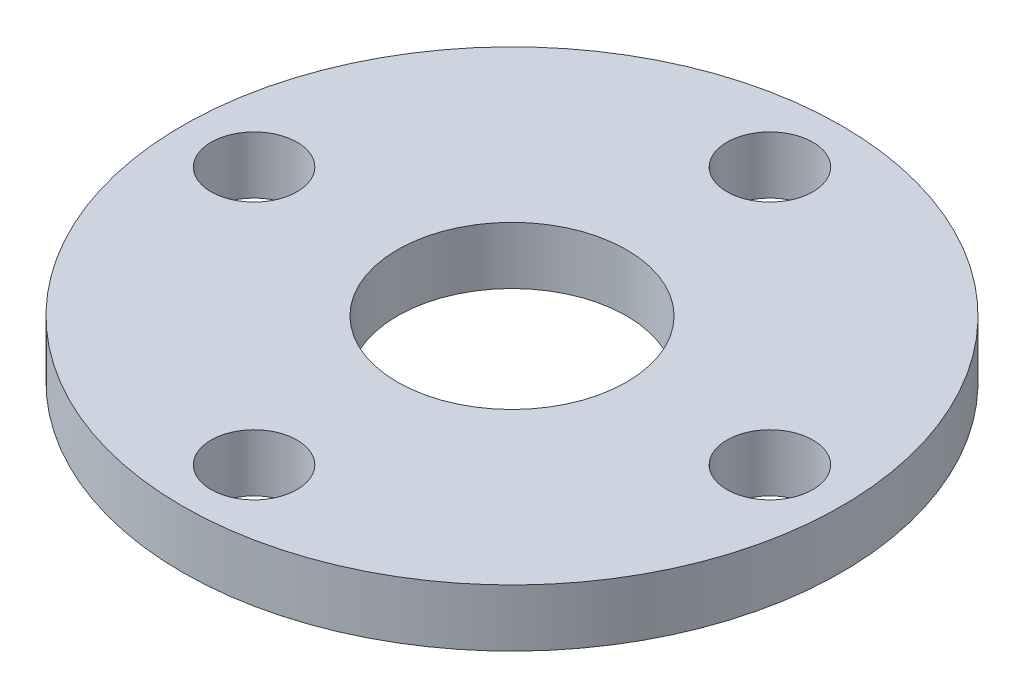
ISO-10303-21;
HEADER;
FILE_DESCRIPTION(('STEP AP214'),'2;1');
FILE_NAME('part.step','',(''),(''),'','','');
FILE_SCHEMA(('AUTOMOTIVE_DESIGN { 1 0 10303 214 1 1 1 1 }'));
ENDSEC;
DATA;
#1=APPLICATION_CONTEXT('core data for automotive mechanical design processes');
#2=APPLICATION_PROTOCOL_DEFINITION('international standard','automotive_design',2000,#1);
#3=PRODUCT_CONTEXT('',#1,'mechanical');
#4=PRODUCT('Part','Part','',(#3));
#5=PRODUCT_RELATED_PRODUCT_CATEGORY('part','',(#4));
#6=PRODUCT_DEFINITION_FORMATION('','',#4);
#7=PRODUCT_DEFINITION_CONTEXT('part definition',#1,'design');
#8=PRODUCT_DEFINITION('design','',#6,#7);
#9=PRODUCT_DEFINITION_SHAPE('','',#8);
#10=(LENGTH_UNIT() NAMED_UNIT(*) SI_UNIT(.MILLI.,.METRE.));
#11=(NAMED_UNIT(*) PLANE_ANGLE_UNIT() SI_UNIT($,.RADIAN.));
#12=(NAMED_UNIT(*) SI_UNIT($,.STERADIAN.) SOLID_ANGLE_UNIT());
#13=UNCERTAINTY_MEASURE_WITH_UNIT(LENGTH_MEASURE(1.E-05),#10,'distance_accuracy_value','');
#14=(GEOMETRIC_REPRESENTATION_CONTEXT(3) GLOBAL_UNCERTAINTY_ASSIGNED_CONTEXT((#13)) GLOBAL_UNIT_ASSIGNED_CONTEXT((#10,
#11,#12)) REPRESENTATION_CONTEXT('',''));
#15=CARTESIAN_POINT('',(0.,0.,0.));
#16=DIRECTION('',(0.,0.,1.));
#17=DIRECTION('',(1.,0.,0.));
#18=AXIS2_PLACEMENT_3D('',#15,#16,#17);
#19=CARTESIAN_POINT('',(0.,2.,0.));
#20=DIRECTION('',(0.,1.,0.));
#21=DIRECTION('',(0.,0.,1.));
#22=AXIS2_PLACEMENT_3D('',#19,#20,#21);
#23=PLANE('',#22);
#24=CARTESIAN_POINT('',(-9.,2.,0.));
#25=DIRECTION('',(0.,1.,0.));
#26=DIRECTION('',(0.,0.,1.));
#27=AXIS2_PLACEMENT_3D('',#24,#25,#26);
#28=CIRCLE('',#27,1.5);
#29=CARTESIAN_POINT('',(-9.,2.,1.5));
#30=VERTEX_POINT('',#29);
#31=EDGE_CURVE('E59',#30,#30,#28,.T.);
#32=ORIENTED_EDGE('',*,*,#31,.F.);
#33=EDGE_LOOP('',(#32));
#34=FACE_BOUND('',#33,.T.);
#35=CARTESIAN_POINT('',(9.,2.,0.));
#36=DIRECTION('',(0.,1.,0.));
#37=DIRECTION('',(0.,0.,1.));
#38=AXIS2_PLACEMENT_3D('',#35,#36,#37);
#39=CIRCLE('',#38,1.5);
#40=CARTESIAN_POINT('',(9.,2.,1.5));
#41=VERTEX_POINT('',#40);
#42=EDGE_CURVE('E47',#41,#41,#39,.T.);
#43=ORIENTED_EDGE('',*,*,#42,.F.);
#44=EDGE_LOOP('',(#43));
#45=FACE_BOUND('',#44,.T.);
#46=CARTESIAN_POINT('',(0.,2.,0.));
#47=DIRECTION('',(0.,1.,0.));
#48=DIRECTION('',(0.,0.,1.));
#49=AXIS2_PLACEMENT_3D('',#46,#47,#48);
#50=CIRCLE('',#49,11.5);
#51=CARTESIAN_POINT('',(0.,2.,11.5));
#52=VERTEX_POINT('',#51);
#53=EDGE_CURVE('E10',#52,#52,#50,.T.);
#54=ORIENTED_EDGE('',*,*,#53,.T.);
#55=EDGE_LOOP('',(#54));
#56=FACE_BOUND('',#55,.T.);
#57=CARTESIAN_POINT('',(0.,2.,0.));
#58=DIRECTION('',(0.,1.,0.));
#59=DIRECTION('',(0.,0.,1.));
#60=AXIS2_PLACEMENT_3D('',#57,#58,#59);
#61=CIRCLE('',#60,4.);
#62=CARTESIAN_POINT('',(0.,2.,4.));
#63=VERTEX_POINT('',#62);
#64=EDGE_CURVE('E42',#63,#63,#61,.T.);
#65=ORIENTED_EDGE('',*,*,#64,.F.);
#66=EDGE_LOOP('',(#65));
#67=FACE_BOUND('',#66,.T.);
#68=CARTESIAN_POINT('',(0.,2.,-9.));
#69=DIRECTION('',(0.,1.,0.));
#70=DIRECTION('',(0.,0.,1.));
#71=AXIS2_PLACEMENT_3D('',#68,#69,#70);
#72=CIRCLE('',#71,1.5);
#73=CARTESIAN_POINT('',(0.,2.,-7.5));
#74=VERTEX_POINT('',#73);
#75=EDGE_CURVE('E53',#74,#74,#72,.T.);
#76=ORIENTED_EDGE('',*,*,#75,.F.);
#77=EDGE_LOOP('',(#76));
#78=FACE_BOUND('',#77,.T.);
#79=CARTESIAN_POINT('',(0.,2.,9.));
#80=DIRECTION('',(0.,1.,0.));
#81=DIRECTION('',(0.,0.,1.));
#82=AXIS2_PLACEMENT_3D('',#79,#80,#81);
#83=CIRCLE('',#82,1.5);
#84=CARTESIAN_POINT('',(0.,2.,10.5));
#85=VERTEX_POINT('',#84);
#86=EDGE_CURVE('E65',#85,#85,#83,.T.);
#87=ORIENTED_EDGE('',*,*,#86,.F.);
#88=EDGE_LOOP('',(#87));
#89=FACE_BOUND('',#88,.T.);
#90=ADVANCED_FACE('F31',(#34,#45,#56,#67,#78,#89),#23,.T.);
#91=CARTESIAN_POINT('',(0.,0.,0.));
#92=DIRECTION('',(0.,1.,0.));
#93=DIRECTION('',(0.,0.,1.));
#94=AXIS2_PLACEMENT_3D('',#91,#92,#93);
#95=PLANE('',#94);
#96=CARTESIAN_POINT('',(0.,0.,0.));
#97=DIRECTION('',(0.,1.,0.));
#98=DIRECTION('',(0.,0.,1.));
#99=AXIS2_PLACEMENT_3D('',#96,#97,#98);
#100=CIRCLE('',#99,11.5);
#101=CARTESIAN_POINT('',(0.,0.,11.5));
#102=VERTEX_POINT('',#101);
#103=EDGE_CURVE('E35',#102,#102,#100,.T.);
#104=ORIENTED_EDGE('',*,*,#103,.F.);
#105=EDGE_LOOP('',(#104));
#106=FACE_BOUND('',#105,.T.);
#107=CARTESIAN_POINT('',(0.,0.,0.));
#108=DIRECTION('',(0.,1.,0.));
#109=DIRECTION('',(0.,0.,1.));
#110=AXIS2_PLACEMENT_3D('',#107,#108,#109);
#111=CIRCLE('',#110,4.);
#112=CARTESIAN_POINT('',(0.,0.,4.));
#113=VERTEX_POINT('',#112);
#114=EDGE_CURVE('E44',#113,#113,#111,.T.);
#115=ORIENTED_EDGE('',*,*,#114,.T.);
#116=EDGE_LOOP('',(#115));
#117=FACE_BOUND('',#116,.T.);
#118=CARTESIAN_POINT('',(9.,0.,0.));
#119=DIRECTION('',(0.,1.,0.));
#120=DIRECTION('',(0.,0.,1.));
#121=AXIS2_PLACEMENT_3D('',#118,#119,#120);
#122=CIRCLE('',#121,1.5);
#123=CARTESIAN_POINT('',(9.,0.,1.5));
#124=VERTEX_POINT('',#123);
#125=EDGE_CURVE('E50',#124,#124,#122,.T.);
#126=ORIENTED_EDGE('',*,*,#125,.T.);
#127=EDGE_LOOP('',(#126));
#128=FACE_BOUND('',#127,.T.);
#129=CARTESIAN_POINT('',(0.,0.,-9.));
#130=DIRECTION('',(0.,1.,0.));
#131=DIRECTION('',(0.,0.,1.));
#132=AXIS2_PLACEMENT_3D('',#129,#130,#131);
#133=CIRCLE('',#132,1.5);
#134=CARTESIAN_POINT('',(0.,0.,-7.5));
#135=VERTEX_POINT('',#134);
#136=EDGE_CURVE('E56',#135,#135,#133,.T.);
#137=ORIENTED_EDGE('',*,*,#136,.T.);
#138=EDGE_LOOP('',(#137));
#139=FACE_BOUND('',#138,.T.);
#140=CARTESIAN_POINT('',(-9.,0.,0.));
#141=DIRECTION('',(0.,1.,0.));
#142=DIRECTION('',(0.,0.,1.));
#143=AXIS2_PLACEMENT_3D('',#140,#141,#142);
#144=CIRCLE('',#143,1.5);
#145=CARTESIAN_POINT('',(-9.,0.,1.5));
#146=VERTEX_POINT('',#145);
#147=EDGE_CURVE('E62',#146,#146,#144,.T.);
#148=ORIENTED_EDGE('',*,*,#147,.T.);
#149=EDGE_LOOP('',(#148));
#150=FACE_BOUND('',#149,.T.);
#151=CARTESIAN_POINT('',(0.,0.,9.));
#152=DIRECTION('',(0.,1.,0.));
#153=DIRECTION('',(0.,0.,1.));
#154=AXIS2_PLACEMENT_3D('',#151,#152,#153);
#155=CIRCLE('',#154,1.5);
#156=CARTESIAN_POINT('',(0.,0.,10.5));
#157=VERTEX_POINT('',#156);
#158=EDGE_CURVE('E68',#157,#157,#155,.T.);
#159=ORIENTED_EDGE('',*,*,#158,.T.);
#160=EDGE_LOOP('',(#159));
#161=FACE_BOUND('',#160,.T.);
#162=ADVANCED_FACE('F78',(#106,#117,#128,#139,#150,#161),#95,.F.);
#163=CARTESIAN_POINT('',(0.,2.,0.));
#164=DIRECTION('',(0.,-1.,0.));
#165=DIRECTION('',(0.,0.,-1.));
#166=AXIS2_PLACEMENT_3D('',#163,#164,#165);
#167=CYLINDRICAL_SURFACE('',#166,11.5);
#168=ORIENTED_EDGE('',*,*,#53,.F.);
#169=EDGE_LOOP('',(#168));
#170=FACE_BOUND('',#169,.T.);
#171=ORIENTED_EDGE('',*,*,#103,.T.);
#172=EDGE_LOOP('',(#171));
#173=FACE_BOUND('',#172,.T.);
#174=ADVANCED_FACE('F33',(#170,#173),#167,.T.);
#175=CARTESIAN_POINT('',(0.,2.,0.));
#176=DIRECTION('',(0.,-1.,0.));
#177=DIRECTION('',(0.,0.,-1.));
#178=AXIS2_PLACEMENT_3D('',#175,#176,#177);
#179=CYLINDRICAL_SURFACE('',#178,4.);
#180=ORIENTED_EDGE('',*,*,#64,.T.);
#181=EDGE_LOOP('',(#180));
#182=FACE_BOUND('',#181,.T.);
#183=ORIENTED_EDGE('',*,*,#114,.F.);
#184=EDGE_LOOP('',(#183));
#185=FACE_BOUND('',#184,.T.);
#186=ADVANCED_FACE('F88',(#182,#185),#179,.F.);
#187=CARTESIAN_POINT('',(9.,2.,0.));
#188=DIRECTION('',(0.,-1.,0.));
#189=DIRECTION('',(0.,0.,-1.));
#190=AXIS2_PLACEMENT_3D('',#187,#188,#189);
#191=CYLINDRICAL_SURFACE('',#190,1.5);
#192=ORIENTED_EDGE('',*,*,#42,.T.);
#193=EDGE_LOOP('',(#192));
#194=FACE_BOUND('',#193,.T.);
#195=ORIENTED_EDGE('',*,*,#125,.F.);
#196=EDGE_LOOP('',(#195));
#197=FACE_BOUND('',#196,.T.);
#198=ADVANCED_FACE('F91',(#194,#197),#191,.F.);
#199=CARTESIAN_POINT('',(0.,2.,-9.));
#200=DIRECTION('',(0.,-1.,0.));
#201=DIRECTION('',(0.,0.,-1.));
#202=AXIS2_PLACEMENT_3D('',#199,#200,#201);
#203=CYLINDRICAL_SURFACE('',#202,1.5);
#204=ORIENTED_EDGE('',*,*,#75,.T.);
#205=EDGE_LOOP('',(#204));
#206=FACE_BOUND('',#205,.T.);
#207=ORIENTED_EDGE('',*,*,#136,.F.);
#208=EDGE_LOOP('',(#207));
#209=FACE_BOUND('',#208,.T.);
#210=ADVANCED_FACE('F95',(#206,#209),#203,.F.);
#211=CARTESIAN_POINT('',(-9.,2.,0.));
#212=DIRECTION('',(0.,-1.,0.));
#213=DIRECTION('',(0.,0.,-1.));
#214=AXIS2_PLACEMENT_3D('',#211,#212,#213);
#215=CYLINDRICAL_SURFACE('',#214,1.5);
#216=ORIENTED_EDGE('',*,*,#31,.T.);
#217=EDGE_LOOP('',(#216));
#218=FACE_BOUND('',#217,.T.);
#219=ORIENTED_EDGE('',*,*,#147,.F.);
#220=EDGE_LOOP('',(#219));
#221=FACE_BOUND('',#220,.T.);
#222=ADVANCED_FACE('F99',(#218,#221),#215,.F.);
#223=CARTESIAN_POINT('',(0.,2.,9.));
#224=DIRECTION('',(0.,-1.,0.));
#225=DIRECTION('',(0.,0.,-1.));
#226=AXIS2_PLACEMENT_3D('',#223,#224,#225);
#227=CYLINDRICAL_SURFACE('',#226,1.5);
#228=ORIENTED_EDGE('',*,*,#86,.T.);
#229=EDGE_LOOP('',(#228));
#230=FACE_BOUND('',#229,.T.);
#231=ORIENTED_EDGE('',*,*,#158,.F.);
#232=EDGE_LOOP('',(#231));
#233=FACE_BOUND('',#232,.T.);
#234=ADVANCED_FACE('F74',(#230,#233),#227,.F.);
#235=CLOSED_SHELL('',(#90,#162,#174,#186,#198,#210,#222,#234));
#236=MANIFOLD_SOLID_BREP('B2',#235);
#237=ADVANCED_BREP_SHAPE_REPRESENTATION('',(#18,#236),#14);
#238=SHAPE_DEFINITION_REPRESENTATION(#9,#237);
ENDSEC;
END-ISO-10303-21;
